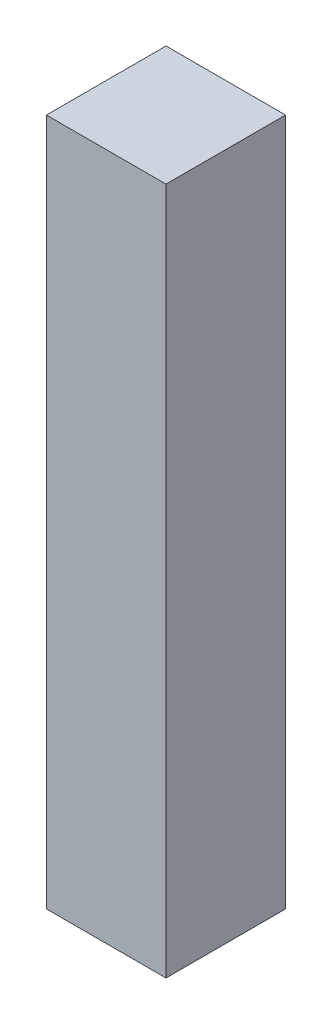
ISO-10303-21;
HEADER;
FILE_DESCRIPTION(('STEP AP214'),'2;1');
FILE_NAME('part.step','',(''),(''),'','','');
FILE_SCHEMA(('AUTOMOTIVE_DESIGN { 1 0 10303 214 1 1 1 1 }'));
ENDSEC;
DATA;
#1=APPLICATION_CONTEXT('core data for automotive mechanical design processes');
#2=APPLICATION_PROTOCOL_DEFINITION('international standard','automotive_design',2000,#1);
#3=PRODUCT_CONTEXT('',#1,'mechanical');
#4=PRODUCT('Part','Part','',(#3));
#5=PRODUCT_RELATED_PRODUCT_CATEGORY('part','',(#4));
#6=PRODUCT_DEFINITION_FORMATION('','',#4);
#7=PRODUCT_DEFINITION_CONTEXT('part definition',#1,'design');
#8=PRODUCT_DEFINITION('design','',#6,#7);
#9=PRODUCT_DEFINITION_SHAPE('','',#8);
#10=(LENGTH_UNIT() NAMED_UNIT(*) SI_UNIT(.MILLI.,.METRE.));
#11=(NAMED_UNIT(*) PLANE_ANGLE_UNIT() SI_UNIT($,.RADIAN.));
#12=(NAMED_UNIT(*) SI_UNIT($,.STERADIAN.) SOLID_ANGLE_UNIT());
#13=UNCERTAINTY_MEASURE_WITH_UNIT(LENGTH_MEASURE(1.E-05),#10,'distance_accuracy_value','');
#14=(GEOMETRIC_REPRESENTATION_CONTEXT(3) GLOBAL_UNCERTAINTY_ASSIGNED_CONTEXT((#13)) GLOBAL_UNIT_ASSIGNED_CONTEXT((#10,
#11,#12)) REPRESENTATION_CONTEXT('',''));
#15=CARTESIAN_POINT('',(0.,0.,0.));
#16=DIRECTION('',(0.,0.,1.));
#17=DIRECTION('',(1.,0.,0.));
#18=AXIS2_PLACEMENT_3D('',#15,#16,#17);
#19=CARTESIAN_POINT('',(-487.247374962251,230.,647.030369645084));
#20=DIRECTION('',(1.,0.,0.));
#21=DIRECTION('',(0.,0.,-1.));
#22=AXIS2_PLACEMENT_3D('',#19,#20,#21);
#23=PLANE('',#22);
#24=DIRECTION('',(0.,0.,1.));
#25=VECTOR('',#24,1.);
#26=CARTESIAN_POINT('',(-487.247374962251,0.,647.030369645084));
#27=LINE('',#26,#25);
#28=CARTESIAN_POINT('',(-487.247374962251,0.,647.030369645084));
#29=VERTEX_POINT('',#28);
#30=CARTESIAN_POINT('',(-487.247374962251,0.,687.030369645084));
#31=VERTEX_POINT('',#30);
#32=EDGE_CURVE('E96',#29,#31,#27,.T.);
#33=ORIENTED_EDGE('',*,*,#32,.T.);
#34=DIRECTION('',(0.,-1.,0.));
#35=VECTOR('',#34,1.);
#36=CARTESIAN_POINT('',(-487.247374962251,230.,687.030369645084));
#37=LINE('',#36,#35);
#38=CARTESIAN_POINT('',(-487.247374962251,230.,687.030369645084));
#39=VERTEX_POINT('',#38);
#40=EDGE_CURVE('E11',#39,#31,#37,.T.);
#41=ORIENTED_EDGE('',*,*,#40,.F.);
#42=DIRECTION('',(0.,0.,1.));
#43=VECTOR('',#42,1.);
#44=CARTESIAN_POINT('',(-487.247374962251,230.,647.030369645084));
#45=LINE('',#44,#43);
#46=CARTESIAN_POINT('',(-487.247374962251,230.,647.030369645084));
#47=VERTEX_POINT('',#46);
#48=EDGE_CURVE('E84',#47,#39,#45,.T.);
#49=ORIENTED_EDGE('',*,*,#48,.F.);
#50=DIRECTION('',(0.,-1.,0.));
#51=VECTOR('',#50,1.);
#52=CARTESIAN_POINT('',(-487.247374962251,230.,647.030369645084));
#53=LINE('',#52,#51);
#54=EDGE_CURVE('E92',#47,#29,#53,.T.);
#55=ORIENTED_EDGE('',*,*,#54,.T.);
#56=EDGE_LOOP('',(#33,#41,#49,#55));
#57=FACE_BOUND('',#56,.T.);
#58=ADVANCED_FACE('F33',(#57),#23,.F.);
#59=CARTESIAN_POINT('',(-487.247374962251,230.,687.030369645084));
#60=DIRECTION('',(0.,0.,-1.));
#61=DIRECTION('',(-1.,0.,0.));
#62=AXIS2_PLACEMENT_3D('',#59,#60,#61);
#63=PLANE('',#62);
#64=DIRECTION('',(1.,0.,0.));
#65=VECTOR('',#64,1.);
#66=CARTESIAN_POINT('',(-487.247374962251,0.,687.030369645084));
#67=LINE('',#66,#65);
#68=CARTESIAN_POINT('',(-447.247374962251,0.,687.030369645084));
#69=VERTEX_POINT('',#68);
#70=EDGE_CURVE('E88',#31,#69,#67,.T.);
#71=ORIENTED_EDGE('',*,*,#70,.T.);
#72=DIRECTION('',(0.,-1.,0.));
#73=VECTOR('',#72,1.);
#74=CARTESIAN_POINT('',(-447.247374962251,230.,687.030369645084));
#75=LINE('',#74,#73);
#76=CARTESIAN_POINT('',(-447.247374962251,230.,687.030369645084));
#77=VERTEX_POINT('',#76);
#78=EDGE_CURVE('E41',#77,#69,#75,.T.);
#79=ORIENTED_EDGE('',*,*,#78,.F.);
#80=DIRECTION('',(1.,0.,0.));
#81=VECTOR('',#80,1.);
#82=CARTESIAN_POINT('',(-487.247374962251,230.,687.030369645084));
#83=LINE('',#82,#81);
#84=EDGE_CURVE('E79',#39,#77,#83,.T.);
#85=ORIENTED_EDGE('',*,*,#84,.F.);
#86=ORIENTED_EDGE('',*,*,#40,.T.);
#87=EDGE_LOOP('',(#71,#79,#85,#86));
#88=FACE_BOUND('',#87,.T.);
#89=ADVANCED_FACE('F87',(#88),#63,.F.);
#90=CARTESIAN_POINT('',(-447.247374962251,230.,647.030369645084));
#91=DIRECTION('',(-1.,0.,0.));
#92=DIRECTION('',(0.,0.,1.));
#93=AXIS2_PLACEMENT_3D('',#90,#91,#92);
#94=PLANE('',#93);
#95=DIRECTION('',(0.,0.,-1.));
#96=VECTOR('',#95,1.);
#97=CARTESIAN_POINT('',(-447.247374962251,0.,647.030369645084));
#98=LINE('',#97,#96);
#99=CARTESIAN_POINT('',(-447.247374962251,0.,647.030369645084));
#100=VERTEX_POINT('',#99);
#101=EDGE_CURVE('E66',#69,#100,#98,.T.);
#102=ORIENTED_EDGE('',*,*,#101,.T.);
#103=DIRECTION('',(0.,-1.,0.));
#104=VECTOR('',#103,1.);
#105=CARTESIAN_POINT('',(-447.247374962251,230.,647.030369645084));
#106=LINE('',#105,#104);
#107=CARTESIAN_POINT('',(-447.247374962251,230.,647.030369645084));
#108=VERTEX_POINT('',#107);
#109=EDGE_CURVE('E89',#108,#100,#106,.T.);
#110=ORIENTED_EDGE('',*,*,#109,.F.);
#111=DIRECTION('',(0.,0.,-1.));
#112=VECTOR('',#111,1.);
#113=CARTESIAN_POINT('',(-447.247374962251,230.,647.030369645084));
#114=LINE('',#113,#112);
#115=EDGE_CURVE('E82',#77,#108,#114,.T.);
#116=ORIENTED_EDGE('',*,*,#115,.F.);
#117=ORIENTED_EDGE('',*,*,#78,.T.);
#118=EDGE_LOOP('',(#102,#110,#116,#117));
#119=FACE_BOUND('',#118,.T.);
#120=ADVANCED_FACE('F90',(#119),#94,.F.);
#121=CARTESIAN_POINT('',(-487.247374962251,230.,647.030369645084));
#122=DIRECTION('',(0.,0.,1.));
#123=DIRECTION('',(1.,0.,0.));
#124=AXIS2_PLACEMENT_3D('',#121,#122,#123);
#125=PLANE('',#124);
#126=DIRECTION('',(-1.,0.,0.));
#127=VECTOR('',#126,1.);
#128=CARTESIAN_POINT('',(-487.247374962251,0.,647.030369645084));
#129=LINE('',#128,#127);
#130=EDGE_CURVE('E72',#100,#29,#129,.T.);
#131=ORIENTED_EDGE('',*,*,#130,.T.);
#132=ORIENTED_EDGE('',*,*,#54,.F.);
#133=DIRECTION('',(-1.,0.,0.));
#134=VECTOR('',#133,1.);
#135=CARTESIAN_POINT('',(-487.247374962251,230.,647.030369645084));
#136=LINE('',#135,#134);
#137=EDGE_CURVE('E49',#108,#47,#136,.T.);
#138=ORIENTED_EDGE('',*,*,#137,.F.);
#139=ORIENTED_EDGE('',*,*,#109,.T.);
#140=EDGE_LOOP('',(#131,#132,#138,#139));
#141=FACE_BOUND('',#140,.T.);
#142=ADVANCED_FACE('F103',(#141),#125,.F.);
#143=CARTESIAN_POINT('',(0.,230.,0.));
#144=DIRECTION('',(0.,1.,0.));
#145=DIRECTION('',(0.,0.,1.));
#146=AXIS2_PLACEMENT_3D('',#143,#144,#145);
#147=PLANE('',#146);
#148=ORIENTED_EDGE('',*,*,#48,.T.);
#149=ORIENTED_EDGE('',*,*,#84,.T.);
#150=ORIENTED_EDGE('',*,*,#115,.T.);
#151=ORIENTED_EDGE('',*,*,#137,.T.);
#152=EDGE_LOOP('',(#148,#149,#150,#151));
#153=FACE_BOUND('',#152,.T.);
#154=ADVANCED_FACE('F80',(#153),#147,.T.);
#155=CARTESIAN_POINT('',(0.,0.,0.));
#156=DIRECTION('',(0.,1.,0.));
#157=DIRECTION('',(0.,0.,1.));
#158=AXIS2_PLACEMENT_3D('',#155,#156,#157);
#159=PLANE('',#158);
#160=ORIENTED_EDGE('',*,*,#32,.F.);
#161=ORIENTED_EDGE('',*,*,#130,.F.);
#162=ORIENTED_EDGE('',*,*,#101,.F.);
#163=ORIENTED_EDGE('',*,*,#70,.F.);
#164=EDGE_LOOP('',(#160,#161,#162,#163));
#165=FACE_BOUND('',#164,.T.);
#166=ADVANCED_FACE('F106',(#165),#159,.F.);
#167=CLOSED_SHELL('',(#58,#89,#120,#142,#154,#166));
#168=MANIFOLD_SOLID_BREP('B2',#167);
#169=ADVANCED_BREP_SHAPE_REPRESENTATION('',(#18,#168),#14);
#170=SHAPE_DEFINITION_REPRESENTATION(#9,#169);
ENDSEC;
END-ISO-10303-21;
